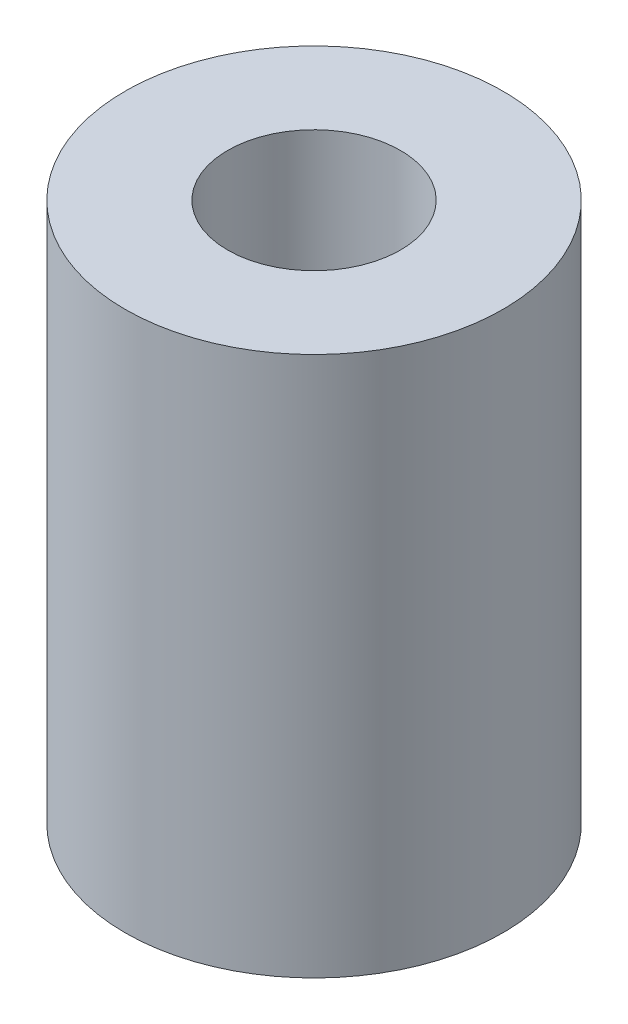
ISO-10303-21;
HEADER;
FILE_DESCRIPTION(('STEP AP214'),'2;1');
FILE_NAME('part.step','',(''),(''),'','','');
FILE_SCHEMA(('AUTOMOTIVE_DESIGN { 1 0 10303 214 1 1 1 1 }'));
ENDSEC;
DATA;
#1=APPLICATION_CONTEXT('core data for automotive mechanical design processes');
#2=APPLICATION_PROTOCOL_DEFINITION('international standard','automotive_design',2000,#1);
#3=PRODUCT_CONTEXT('',#1,'mechanical');
#4=PRODUCT('Part','Part','',(#3));
#5=PRODUCT_RELATED_PRODUCT_CATEGORY('part','',(#4));
#6=PRODUCT_DEFINITION_FORMATION('','',#4);
#7=PRODUCT_DEFINITION_CONTEXT('part definition',#1,'design');
#8=PRODUCT_DEFINITION('design','',#6,#7);
#9=PRODUCT_DEFINITION_SHAPE('','',#8);
#10=(LENGTH_UNIT() NAMED_UNIT(*) SI_UNIT(.MILLI.,.METRE.));
#11=(NAMED_UNIT(*) PLANE_ANGLE_UNIT() SI_UNIT($,.RADIAN.));
#12=(NAMED_UNIT(*) SI_UNIT($,.STERADIAN.) SOLID_ANGLE_UNIT());
#13=UNCERTAINTY_MEASURE_WITH_UNIT(LENGTH_MEASURE(1.E-05),#10,'distance_accuracy_value','');
#14=(GEOMETRIC_REPRESENTATION_CONTEXT(3) GLOBAL_UNCERTAINTY_ASSIGNED_CONTEXT((#13)) GLOBAL_UNIT_ASSIGNED_CONTEXT((#10,
#11,#12)) REPRESENTATION_CONTEXT('',''));
#15=CARTESIAN_POINT('',(0.,0.,0.));
#16=DIRECTION('',(0.,0.,1.));
#17=DIRECTION('',(1.,0.,0.));
#18=AXIS2_PLACEMENT_3D('',#15,#16,#17);
#19=CARTESIAN_POINT('',(0.,5.,0.));
#20=DIRECTION('',(0.,1.,0.));
#21=DIRECTION('',(0.,0.,1.));
#22=AXIS2_PLACEMENT_3D('',#19,#20,#21);
#23=PLANE('',#22);
#24=CARTESIAN_POINT('',(0.,5.,0.));
#25=DIRECTION('',(0.,1.,0.));
#26=DIRECTION('',(0.,0.,1.));
#27=AXIS2_PLACEMENT_3D('',#24,#25,#26);
#28=CIRCLE('',#27,3.5);
#29=CARTESIAN_POINT('',(0.,5.,3.5));
#30=VERTEX_POINT('',#29);
#31=EDGE_CURVE('E10',#30,#30,#28,.T.);
#32=ORIENTED_EDGE('',*,*,#31,.T.);
#33=EDGE_LOOP('',(#32));
#34=FACE_BOUND('',#33,.T.);
#35=CARTESIAN_POINT('',(0.,5.,0.));
#36=DIRECTION('',(0.,1.,0.));
#37=DIRECTION('',(0.,0.,1.));
#38=AXIS2_PLACEMENT_3D('',#35,#36,#37);
#39=CIRCLE('',#38,1.6);
#40=CARTESIAN_POINT('',(0.,5.,1.6));
#41=VERTEX_POINT('',#40);
#42=EDGE_CURVE('E43',#41,#41,#39,.T.);
#43=ORIENTED_EDGE('',*,*,#42,.F.);
#44=EDGE_LOOP('',(#43));
#45=FACE_BOUND('',#44,.T.);
#46=ADVANCED_FACE('F32',(#34,#45),#23,.T.);
#47=CARTESIAN_POINT('',(0.,-5.,0.));
#48=DIRECTION('',(0.,1.,0.));
#49=DIRECTION('',(0.,0.,1.));
#50=AXIS2_PLACEMENT_3D('',#47,#48,#49);
#51=PLANE('',#50);
#52=CARTESIAN_POINT('',(0.,-5.,0.));
#53=DIRECTION('',(0.,1.,0.));
#54=DIRECTION('',(0.,0.,1.));
#55=AXIS2_PLACEMENT_3D('',#52,#53,#54);
#56=CIRCLE('',#55,3.5);
#57=CARTESIAN_POINT('',(0.,-5.,3.5));
#58=VERTEX_POINT('',#57);
#59=EDGE_CURVE('E36',#58,#58,#56,.T.);
#60=ORIENTED_EDGE('',*,*,#59,.F.);
#61=EDGE_LOOP('',(#60));
#62=FACE_BOUND('',#61,.T.);
#63=CARTESIAN_POINT('',(0.,-5.,0.));
#64=DIRECTION('',(0.,1.,0.));
#65=DIRECTION('',(0.,0.,1.));
#66=AXIS2_PLACEMENT_3D('',#63,#64,#65);
#67=CIRCLE('',#66,1.6);
#68=CARTESIAN_POINT('',(0.,-5.,1.6));
#69=VERTEX_POINT('',#68);
#70=EDGE_CURVE('E45',#69,#69,#67,.T.);
#71=ORIENTED_EDGE('',*,*,#70,.T.);
#72=EDGE_LOOP('',(#71));
#73=FACE_BOUND('',#72,.T.);
#74=ADVANCED_FACE('F55',(#62,#73),#51,.F.);
#75=CARTESIAN_POINT('',(0.,5.,0.));
#76=DIRECTION('',(0.,-1.,0.));
#77=DIRECTION('',(0.,0.,-1.));
#78=AXIS2_PLACEMENT_3D('',#75,#76,#77);
#79=CYLINDRICAL_SURFACE('',#78,3.5);
#80=ORIENTED_EDGE('',*,*,#31,.F.);
#81=EDGE_LOOP('',(#80));
#82=FACE_BOUND('',#81,.T.);
#83=ORIENTED_EDGE('',*,*,#59,.T.);
#84=EDGE_LOOP('',(#83));
#85=FACE_BOUND('',#84,.T.);
#86=ADVANCED_FACE('F34',(#82,#85),#79,.T.);
#87=CARTESIAN_POINT('',(0.,5.,0.));
#88=DIRECTION('',(0.,-1.,0.));
#89=DIRECTION('',(0.,0.,-1.));
#90=AXIS2_PLACEMENT_3D('',#87,#88,#89);
#91=CYLINDRICAL_SURFACE('',#90,1.6);
#92=ORIENTED_EDGE('',*,*,#42,.T.);
#93=EDGE_LOOP('',(#92));
#94=FACE_BOUND('',#93,.T.);
#95=ORIENTED_EDGE('',*,*,#70,.F.);
#96=EDGE_LOOP('',(#95));
#97=FACE_BOUND('',#96,.T.);
#98=ADVANCED_FACE('F51',(#94,#97),#91,.F.);
#99=CLOSED_SHELL('',(#46,#74,#86,#98));
#100=MANIFOLD_SOLID_BREP('B2',#99);
#101=ADVANCED_BREP_SHAPE_REPRESENTATION('',(#18,#100),#14);
#102=SHAPE_DEFINITION_REPRESENTATION(#9,#101);
ENDSEC;
END-ISO-10303-21;
